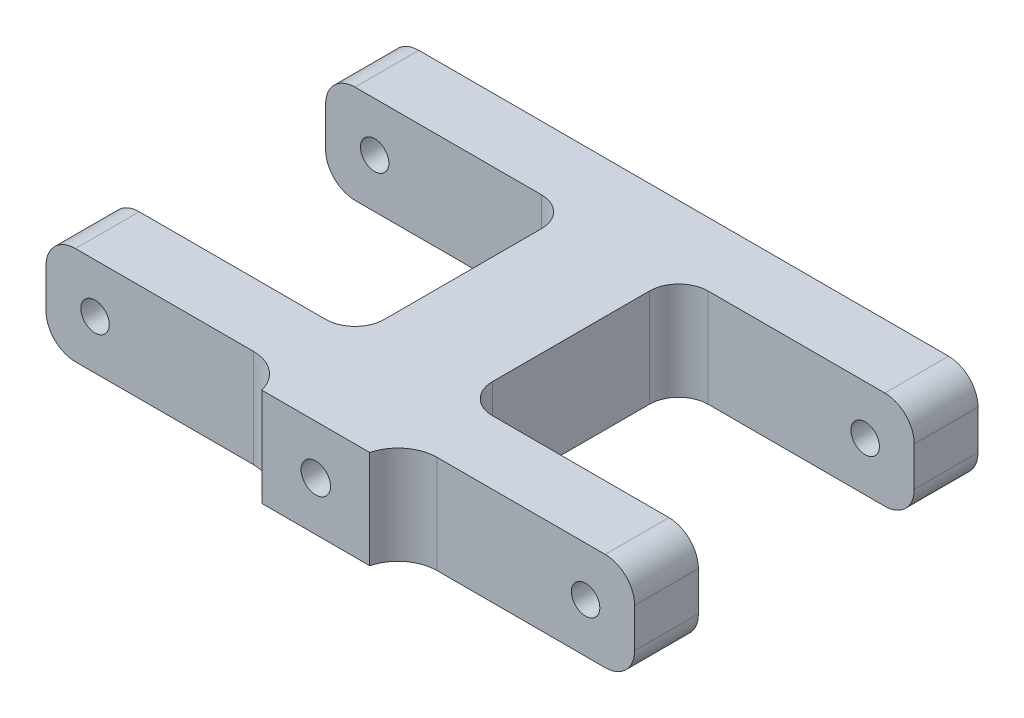
ISO-10303-21;
HEADER;
FILE_DESCRIPTION(('STEP AP214'),'2;1');
FILE_NAME('part.step','',(''),(''),'','','');
FILE_SCHEMA(('AUTOMOTIVE_DESIGN { 1 0 10303 214 1 1 1 1 }'));
ENDSEC;
DATA;
#1=APPLICATION_CONTEXT('core data for automotive mechanical design processes');
#2=APPLICATION_PROTOCOL_DEFINITION('international standard','automotive_design',2000,#1);
#3=PRODUCT_CONTEXT('',#1,'mechanical');
#4=PRODUCT('Part','Part','',(#3));
#5=PRODUCT_RELATED_PRODUCT_CATEGORY('part','',(#4));
#6=PRODUCT_DEFINITION_FORMATION('','',#4);
#7=PRODUCT_DEFINITION_CONTEXT('part definition',#1,'design');
#8=PRODUCT_DEFINITION('design','',#6,#7);
#9=PRODUCT_DEFINITION_SHAPE('','',#8);
#10=(LENGTH_UNIT() NAMED_UNIT(*) SI_UNIT(.MILLI.,.METRE.));
#11=(NAMED_UNIT(*) PLANE_ANGLE_UNIT() SI_UNIT($,.RADIAN.));
#12=(NAMED_UNIT(*) SI_UNIT($,.STERADIAN.) SOLID_ANGLE_UNIT());
#13=UNCERTAINTY_MEASURE_WITH_UNIT(LENGTH_MEASURE(1.E-05),#10,'distance_accuracy_value','');
#14=(GEOMETRIC_REPRESENTATION_CONTEXT(3) GLOBAL_UNCERTAINTY_ASSIGNED_CONTEXT((#13)) GLOBAL_UNIT_ASSIGNED_CONTEXT((#10,
#11,#12)) REPRESENTATION_CONTEXT('',''));
#15=CARTESIAN_POINT('',(0.,0.,0.));
#16=DIRECTION('',(0.,0.,1.));
#17=DIRECTION('',(1.,0.,0.));
#18=AXIS2_PLACEMENT_3D('',#15,#16,#17);
#19=CARTESIAN_POINT('',(0.,10.,35.));
#20=DIRECTION('',(0.,0.,-1.));
#21=DIRECTION('',(-1.,0.,0.));
#22=AXIS2_PLACEMENT_3D('',#19,#20,#21);
#23=PLANE('',#22);
#24=CARTESIAN_POINT('',(5.,5.,35.));
#25=DIRECTION('',(0.,0.,1.));
#26=DIRECTION('',(1.,0.,0.));
#27=AXIS2_PLACEMENT_3D('',#24,#25,#26);
#28=CIRCLE('',#27,1.45);
#29=CARTESIAN_POINT('',(6.45,5.,35.));
#30=VERTEX_POINT('',#29);
#31=EDGE_CURVE('E254',#30,#30,#28,.T.);
#32=ORIENTED_EDGE('',*,*,#31,.F.);
#33=EDGE_LOOP('',(#32));
#34=FACE_BOUND('',#33,.T.);
#35=DIRECTION('',(1.,0.,0.));
#36=VECTOR('',#35,1.);
#37=CARTESIAN_POINT('',(0.,0.,35.));
#38=LINE('',#37,#36);
#39=CARTESIAN_POINT('',(3.,0.,35.));
#40=VERTEX_POINT('',#39);
#41=CARTESIAN_POINT('',(21.1270166537926,0.,35.));
#42=VERTEX_POINT('',#41);
#43=EDGE_CURVE('E312',#40,#42,#38,.T.);
#44=ORIENTED_EDGE('',*,*,#43,.T.);
#45=DIRECTION('',(0.,-1.,0.));
#46=VECTOR('',#45,1.);
#47=CARTESIAN_POINT('',(21.1270166537926,10.,35.));
#48=LINE('',#47,#46);
#49=CARTESIAN_POINT('',(21.1270166537926,10.,35.));
#50=VERTEX_POINT('',#49);
#51=EDGE_CURVE('E54',#42,#50,#48,.F.);
#52=ORIENTED_EDGE('',*,*,#51,.T.);
#53=DIRECTION('',(1.,0.,0.));
#54=VECTOR('',#53,1.);
#55=CARTESIAN_POINT('',(0.,10.,35.));
#56=LINE('',#55,#54);
#57=CARTESIAN_POINT('',(3.,10.,35.));
#58=VERTEX_POINT('',#57);
#59=EDGE_CURVE('E305',#58,#50,#56,.T.);
#60=ORIENTED_EDGE('',*,*,#59,.F.);
#61=CARTESIAN_POINT('',(3.,7.,35.));
#62=DIRECTION('',(0.,0.,-1.));
#63=DIRECTION('',(-1.,0.,0.));
#64=AXIS2_PLACEMENT_3D('',#61,#62,#63);
#65=CIRCLE('',#64,3.);
#66=CARTESIAN_POINT('',(0.,7.,35.));
#67=VERTEX_POINT('',#66);
#68=EDGE_CURVE('E342',#58,#67,#65,.F.);
#69=ORIENTED_EDGE('',*,*,#68,.T.);
#70=DIRECTION('',(0.,-1.,0.));
#71=VECTOR('',#70,1.);
#72=CARTESIAN_POINT('',(0.,10.,35.));
#73=LINE('',#72,#71);
#74=CARTESIAN_POINT('',(0.,3.,35.));
#75=VERTEX_POINT('',#74);
#76=EDGE_CURVE('E325',#67,#75,#73,.T.);
#77=ORIENTED_EDGE('',*,*,#76,.T.);
#78=CARTESIAN_POINT('',(3.,3.,35.));
#79=DIRECTION('',(0.,0.,-1.));
#80=DIRECTION('',(-1.,0.,0.));
#81=AXIS2_PLACEMENT_3D('',#78,#79,#80);
#82=CIRCLE('',#81,3.);
#83=EDGE_CURVE('E344',#75,#40,#82,.F.);
#84=ORIENTED_EDGE('',*,*,#83,.T.);
#85=EDGE_LOOP('',(#44,#52,#60,#69,#77,#84));
#86=FACE_BOUND('',#85,.T.);
#87=ADVANCED_FACE('F33',(#34,#86),#23,.F.);
#88=CARTESIAN_POINT('',(55.,5.,35.));
#89=DIRECTION('',(0.,0.,1.));
#90=DIRECTION('',(1.,0.,0.));
#91=AXIS2_PLACEMENT_3D('',#88,#89,#90);
#92=CIRCLE('',#91,1.45);
#93=CARTESIAN_POINT('',(56.45,5.,35.));
#94=VERTEX_POINT('',#93);
#95=EDGE_CURVE('E244',#94,#94,#92,.T.);
#96=ORIENTED_EDGE('',*,*,#95,.F.);
#97=EDGE_LOOP('',(#96));
#98=FACE_BOUND('',#97,.T.);
#99=CARTESIAN_POINT('',(39.8729833462074,10.,35.));
#100=VERTEX_POINT('',#99);
#101=CARTESIAN_POINT('',(57.,10.,35.));
#102=VERTEX_POINT('',#101);
#103=EDGE_CURVE('E308',#100,#102,#56,.T.);
#104=ORIENTED_EDGE('',*,*,#103,.F.);
#105=DIRECTION('',(0.,1.,0.));
#106=VECTOR('',#105,1.);
#107=CARTESIAN_POINT('',(39.8729833462074,10.,35.));
#108=LINE('',#107,#106);
#109=CARTESIAN_POINT('',(39.8729833462074,0.,35.));
#110=VERTEX_POINT('',#109);
#111=EDGE_CURVE('E448',#100,#110,#108,.F.);
#112=ORIENTED_EDGE('',*,*,#111,.T.);
#113=CARTESIAN_POINT('',(57.,0.,35.));
#114=VERTEX_POINT('',#113);
#115=EDGE_CURVE('E299',#110,#114,#38,.T.);
#116=ORIENTED_EDGE('',*,*,#115,.T.);
#117=CARTESIAN_POINT('',(57.,3.,35.));
#118=DIRECTION('',(0.,0.,-1.));
#119=DIRECTION('',(-1.,0.,0.));
#120=AXIS2_PLACEMENT_3D('',#117,#118,#119);
#121=CIRCLE('',#120,3.);
#122=CARTESIAN_POINT('',(60.,3.,35.));
#123=VERTEX_POINT('',#122);
#124=EDGE_CURVE('E340',#114,#123,#121,.F.);
#125=ORIENTED_EDGE('',*,*,#124,.T.);
#126=DIRECTION('',(0.,-1.,0.));
#127=VECTOR('',#126,1.);
#128=CARTESIAN_POINT('',(60.,10.,35.));
#129=LINE('',#128,#127);
#130=CARTESIAN_POINT('',(60.,7.,35.));
#131=VERTEX_POINT('',#130);
#132=EDGE_CURVE('E322',#131,#123,#129,.T.);
#133=ORIENTED_EDGE('',*,*,#132,.F.);
#134=CARTESIAN_POINT('',(57.,7.,35.));
#135=DIRECTION('',(0.,0.,-1.));
#136=DIRECTION('',(-1.,0.,0.));
#137=AXIS2_PLACEMENT_3D('',#134,#135,#136);
#138=CIRCLE('',#137,3.);
#139=EDGE_CURVE('E337',#131,#102,#138,.F.);
#140=ORIENTED_EDGE('',*,*,#139,.T.);
#141=EDGE_LOOP('',(#104,#112,#116,#125,#133,#140));
#142=FACE_BOUND('',#141,.T.);
#143=ADVANCED_FACE('F460',(#98,#142),#23,.F.);
#144=CARTESIAN_POINT('',(0.,10.,0.));
#145=DIRECTION('',(1.,0.,0.));
#146=DIRECTION('',(0.,0.,-1.));
#147=AXIS2_PLACEMENT_3D('',#144,#145,#146);
#148=PLANE('',#147);
#149=DIRECTION('',(0.,-1.,0.));
#150=VECTOR('',#149,1.);
#151=CARTESIAN_POINT('',(0.,10.,0.));
#152=LINE('',#151,#150);
#153=CARTESIAN_POINT('',(0.,7.,0.));
#154=VERTEX_POINT('',#153);
#155=CARTESIAN_POINT('',(0.,3.,0.));
#156=VERTEX_POINT('',#155);
#157=EDGE_CURVE('E311',#154,#156,#152,.T.);
#158=ORIENTED_EDGE('',*,*,#157,.T.);
#159=DIRECTION('',(0.,0.,1.));
#160=VECTOR('',#159,1.);
#161=CARTESIAN_POINT('',(0.,3.,0.));
#162=LINE('',#161,#160);
#163=CARTESIAN_POINT('',(0.,3.,6.5));
#164=VERTEX_POINT('',#163);
#165=EDGE_CURVE('E376',#156,#164,#162,.T.);
#166=ORIENTED_EDGE('',*,*,#165,.T.);
#167=DIRECTION('',(0.,-1.,0.));
#168=VECTOR('',#167,1.);
#169=CARTESIAN_POINT('',(0.,10.,6.5));
#170=LINE('',#169,#168);
#171=CARTESIAN_POINT('',(0.,7.,6.5));
#172=VERTEX_POINT('',#171);
#173=EDGE_CURVE('E264',#172,#164,#170,.T.);
#174=ORIENTED_EDGE('',*,*,#173,.F.);
#175=DIRECTION('',(0.,0.,1.));
#176=VECTOR('',#175,1.);
#177=CARTESIAN_POINT('',(0.,7.,0.));
#178=LINE('',#177,#176);
#179=EDGE_CURVE('E374',#172,#154,#178,.F.);
#180=ORIENTED_EDGE('',*,*,#179,.T.);
#181=EDGE_LOOP('',(#158,#166,#174,#180));
#182=FACE_BOUND('',#181,.T.);
#183=ADVANCED_FACE('F481',(#182),#148,.F.);
#184=CARTESIAN_POINT('',(60.,10.,0.));
#185=DIRECTION('',(-1.,0.,0.));
#186=DIRECTION('',(0.,0.,1.));
#187=AXIS2_PLACEMENT_3D('',#184,#185,#186);
#188=PLANE('',#187);
#189=ORIENTED_EDGE('',*,*,#132,.T.);
#190=DIRECTION('',(0.,0.,-1.));
#191=VECTOR('',#190,1.);
#192=CARTESIAN_POINT('',(60.,3.,0.));
#193=LINE('',#192,#191);
#194=CARTESIAN_POINT('',(60.,3.,28.5));
#195=VERTEX_POINT('',#194);
#196=EDGE_CURVE('E404',#123,#195,#193,.T.);
#197=ORIENTED_EDGE('',*,*,#196,.T.);
#198=DIRECTION('',(0.,-1.,0.));
#199=VECTOR('',#198,1.);
#200=CARTESIAN_POINT('',(60.,10.,28.5));
#201=LINE('',#200,#199);
#202=CARTESIAN_POINT('',(60.,7.,28.5));
#203=VERTEX_POINT('',#202);
#204=EDGE_CURVE('E279',#203,#195,#201,.T.);
#205=ORIENTED_EDGE('',*,*,#204,.F.);
#206=DIRECTION('',(0.,0.,-1.));
#207=VECTOR('',#206,1.);
#208=CARTESIAN_POINT('',(60.,7.,35.));
#209=LINE('',#208,#207);
#210=EDGE_CURVE('E402',#203,#131,#209,.F.);
#211=ORIENTED_EDGE('',*,*,#210,.T.);
#212=EDGE_LOOP('',(#189,#197,#205,#211));
#213=FACE_BOUND('',#212,.T.);
#214=ADVANCED_FACE('F491',(#213),#188,.F.);
#215=DIRECTION('',(0.,1.,0.));
#216=VECTOR('',#215,1.);
#217=CARTESIAN_POINT('',(0.,10.,28.5));
#218=LINE('',#217,#216);
#219=CARTESIAN_POINT('',(0.,3.,28.5));
#220=VERTEX_POINT('',#219);
#221=CARTESIAN_POINT('',(0.,7.,28.5));
#222=VERTEX_POINT('',#221);
#223=EDGE_CURVE('E269',#220,#222,#218,.T.);
#224=ORIENTED_EDGE('',*,*,#223,.F.);
#225=DIRECTION('',(0.,0.,1.));
#226=VECTOR('',#225,1.);
#227=CARTESIAN_POINT('',(0.,3.,0.));
#228=LINE('',#227,#226);
#229=EDGE_CURVE('E334',#220,#75,#228,.T.);
#230=ORIENTED_EDGE('',*,*,#229,.T.);
#231=ORIENTED_EDGE('',*,*,#76,.F.);
#232=DIRECTION('',(0.,0.,1.));
#233=VECTOR('',#232,1.);
#234=CARTESIAN_POINT('',(0.,7.,28.5));
#235=LINE('',#234,#233);
#236=EDGE_CURVE('E328',#67,#222,#235,.F.);
#237=ORIENTED_EDGE('',*,*,#236,.T.);
#238=EDGE_LOOP('',(#224,#230,#231,#237));
#239=FACE_BOUND('',#238,.T.);
#240=ADVANCED_FACE('F488',(#239),#148,.F.);
#241=DIRECTION('',(0.,-1.,0.));
#242=VECTOR('',#241,1.);
#243=CARTESIAN_POINT('',(60.,10.,0.));
#244=LINE('',#243,#242);
#245=CARTESIAN_POINT('',(60.,7.,0.));
#246=VERTEX_POINT('',#245);
#247=CARTESIAN_POINT('',(60.,3.,0.));
#248=VERTEX_POINT('',#247);
#249=EDGE_CURVE('E319',#246,#248,#244,.T.);
#250=ORIENTED_EDGE('',*,*,#249,.F.);
#251=DIRECTION('',(0.,0.,-1.));
#252=VECTOR('',#251,1.);
#253=CARTESIAN_POINT('',(60.,7.,6.5));
#254=LINE('',#253,#252);
#255=CARTESIAN_POINT('',(60.,7.,6.5));
#256=VERTEX_POINT('',#255);
#257=EDGE_CURVE('E395',#246,#256,#254,.F.);
#258=ORIENTED_EDGE('',*,*,#257,.T.);
#259=DIRECTION('',(0.,1.,0.));
#260=VECTOR('',#259,1.);
#261=CARTESIAN_POINT('',(60.,10.,6.5));
#262=LINE('',#261,#260);
#263=CARTESIAN_POINT('',(60.,3.,6.5));
#264=VERTEX_POINT('',#263);
#265=EDGE_CURVE('E289',#264,#256,#262,.T.);
#266=ORIENTED_EDGE('',*,*,#265,.F.);
#267=DIRECTION('',(0.,0.,-1.));
#268=VECTOR('',#267,1.);
#269=CARTESIAN_POINT('',(60.,3.,0.));
#270=LINE('',#269,#268);
#271=EDGE_CURVE('E392',#264,#248,#270,.T.);
#272=ORIENTED_EDGE('',*,*,#271,.T.);
#273=EDGE_LOOP('',(#250,#258,#266,#272));
#274=FACE_BOUND('',#273,.T.);
#275=ADVANCED_FACE('F486',(#274),#188,.F.);
#276=CARTESIAN_POINT('',(0.,10.,0.));
#277=DIRECTION('',(0.,0.,1.));
#278=DIRECTION('',(1.,0.,0.));
#279=AXIS2_PLACEMENT_3D('',#276,#277,#278);
#280=PLANE('',#279);
#281=CARTESIAN_POINT('',(55.,5.,0.));
#282=DIRECTION('',(0.,0.,1.));
#283=DIRECTION('',(1.,0.,0.));
#284=AXIS2_PLACEMENT_3D('',#281,#282,#283);
#285=CIRCLE('',#284,1.45);
#286=CARTESIAN_POINT('',(56.45,5.,0.));
#287=VERTEX_POINT('',#286);
#288=EDGE_CURVE('E245',#287,#287,#285,.T.);
#289=ORIENTED_EDGE('',*,*,#288,.T.);
#290=EDGE_LOOP('',(#289));
#291=FACE_BOUND('',#290,.T.);
#292=CARTESIAN_POINT('',(5.,5.,0.));
#293=DIRECTION('',(0.,0.,1.));
#294=DIRECTION('',(1.,0.,0.));
#295=AXIS2_PLACEMENT_3D('',#292,#293,#294);
#296=CIRCLE('',#295,1.45);
#297=CARTESIAN_POINT('',(6.45,5.,0.));
#298=VERTEX_POINT('',#297);
#299=EDGE_CURVE('E255',#298,#298,#296,.T.);
#300=ORIENTED_EDGE('',*,*,#299,.T.);
#301=EDGE_LOOP('',(#300));
#302=FACE_BOUND('',#301,.T.);
#303=DIRECTION('',(-1.,0.,0.));
#304=VECTOR('',#303,1.);
#305=CARTESIAN_POINT('',(0.,0.,0.));
#306=LINE('',#305,#304);
#307=CARTESIAN_POINT('',(57.,0.,0.));
#308=VERTEX_POINT('',#307);
#309=CARTESIAN_POINT('',(3.,0.,0.));
#310=VERTEX_POINT('',#309);
#311=EDGE_CURVE('E314',#308,#310,#306,.T.);
#312=ORIENTED_EDGE('',*,*,#311,.T.);
#313=CARTESIAN_POINT('',(3.,3.,0.));
#314=DIRECTION('',(0.,0.,1.));
#315=DIRECTION('',(1.,0.,0.));
#316=AXIS2_PLACEMENT_3D('',#313,#314,#315);
#317=CIRCLE('',#316,3.);
#318=EDGE_CURVE('E390',#310,#156,#317,.F.);
#319=ORIENTED_EDGE('',*,*,#318,.T.);
#320=ORIENTED_EDGE('',*,*,#157,.F.);
#321=CARTESIAN_POINT('',(3.,7.,0.));
#322=DIRECTION('',(0.,0.,1.));
#323=DIRECTION('',(1.,0.,0.));
#324=AXIS2_PLACEMENT_3D('',#321,#322,#323);
#325=CIRCLE('',#324,3.);
#326=CARTESIAN_POINT('',(3.,10.,0.));
#327=VERTEX_POINT('',#326);
#328=EDGE_CURVE('E388',#154,#327,#325,.F.);
#329=ORIENTED_EDGE('',*,*,#328,.T.);
#330=DIRECTION('',(-1.,0.,0.));
#331=VECTOR('',#330,1.);
#332=CARTESIAN_POINT('',(0.,10.,0.));
#333=LINE('',#332,#331);
#334=CARTESIAN_POINT('',(57.,10.,0.));
#335=VERTEX_POINT('',#334);
#336=EDGE_CURVE('E307',#335,#327,#333,.T.);
#337=ORIENTED_EDGE('',*,*,#336,.F.);
#338=CARTESIAN_POINT('',(57.,7.,0.));
#339=DIRECTION('',(0.,0.,1.));
#340=DIRECTION('',(1.,0.,0.));
#341=AXIS2_PLACEMENT_3D('',#338,#339,#340);
#342=CIRCLE('',#341,3.);
#343=EDGE_CURVE('E386',#335,#246,#342,.F.);
#344=ORIENTED_EDGE('',*,*,#343,.T.);
#345=ORIENTED_EDGE('',*,*,#249,.T.);
#346=CARTESIAN_POINT('',(57.,3.,0.));
#347=DIRECTION('',(0.,0.,1.));
#348=DIRECTION('',(1.,0.,0.));
#349=AXIS2_PLACEMENT_3D('',#346,#347,#348);
#350=CIRCLE('',#349,3.);
#351=EDGE_CURVE('E384',#248,#308,#350,.F.);
#352=ORIENTED_EDGE('',*,*,#351,.T.);
#353=EDGE_LOOP('',(#312,#319,#320,#329,#337,#344,#345,#352));
#354=FACE_BOUND('',#353,.T.);
#355=ADVANCED_FACE('F577',(#291,#302,#354),#280,.F.);
#356=CARTESIAN_POINT('',(0.,10.,0.));
#357=DIRECTION('',(0.,1.,0.));
#358=DIRECTION('',(0.,0.,1.));
#359=AXIS2_PLACEMENT_3D('',#356,#357,#358);
#360=PLANE('',#359);
#361=DIRECTION('',(0.,0.,-1.));
#362=VECTOR('',#361,1.);
#363=CARTESIAN_POINT('',(25.,10.,6.5));
#364=LINE('',#363,#362);
#365=CARTESIAN_POINT('',(25.,10.,25.5));
#366=VERTEX_POINT('',#365);
#367=CARTESIAN_POINT('',(25.,10.,9.5));
#368=VERTEX_POINT('',#367);
#369=EDGE_CURVE('E268',#366,#368,#364,.T.);
#370=ORIENTED_EDGE('',*,*,#369,.F.);
#371=CARTESIAN_POINT('',(22.,10.,25.5));
#372=DIRECTION('',(0.,1.,0.));
#373=DIRECTION('',(0.,0.,1.));
#374=AXIS2_PLACEMENT_3D('',#371,#372,#373);
#375=CIRCLE('',#374,3.);
#376=CARTESIAN_POINT('',(22.,10.,28.5));
#377=VERTEX_POINT('',#376);
#378=EDGE_CURVE('E440',#366,#377,#375,.F.);
#379=ORIENTED_EDGE('',*,*,#378,.T.);
#380=DIRECTION('',(-1.,0.,0.));
#381=VECTOR('',#380,1.);
#382=CARTESIAN_POINT('',(25.,10.,28.5));
#383=LINE('',#382,#381);
#384=CARTESIAN_POINT('',(3.,10.,28.5));
#385=VERTEX_POINT('',#384);
#386=EDGE_CURVE('E280',#377,#385,#383,.T.);
#387=ORIENTED_EDGE('',*,*,#386,.T.);
#388=DIRECTION('',(0.,0.,1.));
#389=VECTOR('',#388,1.);
#390=CARTESIAN_POINT('',(3.,10.,35.));
#391=LINE('',#390,#389);
#392=EDGE_CURVE('E371',#385,#58,#391,.T.);
#393=ORIENTED_EDGE('',*,*,#392,.T.);
#394=ORIENTED_EDGE('',*,*,#59,.T.);
#395=CARTESIAN_POINT('',(21.1270166537926,10.,39.));
#396=DIRECTION('',(0.,1.,0.));
#397=DIRECTION('',(0.,0.,1.));
#398=AXIS2_PLACEMENT_3D('',#395,#396,#397);
#399=CIRCLE('',#398,4.);
#400=CARTESIAN_POINT('',(25.,10.,38.));
#401=VERTEX_POINT('',#400);
#402=EDGE_CURVE('E11',#50,#401,#399,.F.);
#403=ORIENTED_EDGE('',*,*,#402,.T.);
#404=DIRECTION('',(-1.,0.,0.));
#405=VECTOR('',#404,1.);
#406=CARTESIAN_POINT('',(25.,10.,38.));
#407=LINE('',#406,#405);
#408=CARTESIAN_POINT('',(36.,10.,38.));
#409=VERTEX_POINT('',#408);
#410=EDGE_CURVE('E234',#409,#401,#407,.T.);
#411=ORIENTED_EDGE('',*,*,#410,.F.);
#412=CARTESIAN_POINT('',(39.8729833462074,10.,39.));
#413=DIRECTION('',(0.,1.,0.));
#414=DIRECTION('',(0.,0.,1.));
#415=AXIS2_PLACEMENT_3D('',#412,#413,#414);
#416=CIRCLE('',#415,4.);
#417=EDGE_CURVE('E451',#409,#100,#416,.F.);
#418=ORIENTED_EDGE('',*,*,#417,.T.);
#419=ORIENTED_EDGE('',*,*,#103,.T.);
#420=DIRECTION('',(0.,0.,-1.));
#421=VECTOR('',#420,1.);
#422=CARTESIAN_POINT('',(57.,10.,28.5));
#423=LINE('',#422,#421);
#424=CARTESIAN_POINT('',(57.,10.,28.5));
#425=VERTEX_POINT('',#424);
#426=EDGE_CURVE('E362',#102,#425,#423,.T.);
#427=ORIENTED_EDGE('',*,*,#426,.T.);
#428=DIRECTION('',(1.,0.,0.));
#429=VECTOR('',#428,1.);
#430=CARTESIAN_POINT('',(36.,10.,28.5));
#431=LINE('',#430,#429);
#432=CARTESIAN_POINT('',(39.,10.,28.5));
#433=VERTEX_POINT('',#432);
#434=EDGE_CURVE('E297',#433,#425,#431,.T.);
#435=ORIENTED_EDGE('',*,*,#434,.F.);
#436=CARTESIAN_POINT('',(39.,10.,25.5));
#437=DIRECTION('',(0.,1.,0.));
#438=DIRECTION('',(0.,0.,1.));
#439=AXIS2_PLACEMENT_3D('',#436,#437,#438);
#440=CIRCLE('',#439,3.);
#441=CARTESIAN_POINT('',(36.,10.,25.5));
#442=VERTEX_POINT('',#441);
#443=EDGE_CURVE('E434',#433,#442,#440,.F.);
#444=ORIENTED_EDGE('',*,*,#443,.T.);
#445=DIRECTION('',(0.,0.,1.));
#446=VECTOR('',#445,1.);
#447=CARTESIAN_POINT('',(36.,10.,28.5));
#448=LINE('',#447,#446);
#449=CARTESIAN_POINT('',(36.,10.,9.5));
#450=VERTEX_POINT('',#449);
#451=EDGE_CURVE('E288',#450,#442,#448,.T.);
#452=ORIENTED_EDGE('',*,*,#451,.F.);
#453=CARTESIAN_POINT('',(39.,10.,9.5));
#454=DIRECTION('',(0.,1.,0.));
#455=DIRECTION('',(0.,0.,1.));
#456=AXIS2_PLACEMENT_3D('',#453,#454,#455);
#457=CIRCLE('',#456,3.);
#458=CARTESIAN_POINT('',(39.,10.,6.5));
#459=VERTEX_POINT('',#458);
#460=EDGE_CURVE('E436',#450,#459,#457,.F.);
#461=ORIENTED_EDGE('',*,*,#460,.T.);
#462=DIRECTION('',(1.,0.,0.));
#463=VECTOR('',#462,1.);
#464=CARTESIAN_POINT('',(36.,10.,6.5));
#465=LINE('',#464,#463);
#466=CARTESIAN_POINT('',(57.,10.,6.5));
#467=VERTEX_POINT('',#466);
#468=EDGE_CURVE('E300',#459,#467,#465,.T.);
#469=ORIENTED_EDGE('',*,*,#468,.T.);
#470=DIRECTION('',(0.,0.,-1.));
#471=VECTOR('',#470,1.);
#472=CARTESIAN_POINT('',(57.,10.,0.));
#473=LINE('',#472,#471);
#474=EDGE_CURVE('E365',#467,#335,#473,.T.);
#475=ORIENTED_EDGE('',*,*,#474,.T.);
#476=ORIENTED_EDGE('',*,*,#336,.T.);
#477=DIRECTION('',(0.,0.,1.));
#478=VECTOR('',#477,1.);
#479=CARTESIAN_POINT('',(3.,10.,6.5));
#480=LINE('',#479,#478);
#481=CARTESIAN_POINT('',(3.,10.,6.5));
#482=VERTEX_POINT('',#481);
#483=EDGE_CURVE('E368',#327,#482,#480,.T.);
#484=ORIENTED_EDGE('',*,*,#483,.T.);
#485=DIRECTION('',(-1.,0.,0.));
#486=VECTOR('',#485,1.);
#487=CARTESIAN_POINT('',(25.,10.,6.5));
#488=LINE('',#487,#486);
#489=CARTESIAN_POINT('',(22.,10.,6.5));
#490=VERTEX_POINT('',#489);
#491=EDGE_CURVE('E277',#490,#482,#488,.T.);
#492=ORIENTED_EDGE('',*,*,#491,.F.);
#493=CARTESIAN_POINT('',(22.,10.,9.5));
#494=DIRECTION('',(0.,1.,0.));
#495=DIRECTION('',(0.,0.,1.));
#496=AXIS2_PLACEMENT_3D('',#493,#494,#495);
#497=CIRCLE('',#496,3.);
#498=EDGE_CURVE('E446',#490,#368,#497,.F.);
#499=ORIENTED_EDGE('',*,*,#498,.T.);
#500=EDGE_LOOP('',(#370,#379,#387,#393,#394,#403,#411,#418,#419,#427,#435,#444,#452,#461,#469,
#475,#476,#484,#492,#499));
#501=FACE_BOUND('',#500,.T.);
#502=ADVANCED_FACE('F456',(#501),#360,.T.);
#503=CARTESIAN_POINT('',(0.,0.,0.));
#504=DIRECTION('',(0.,1.,0.));
#505=DIRECTION('',(0.,0.,1.));
#506=AXIS2_PLACEMENT_3D('',#503,#504,#505);
#507=PLANE('',#506);
#508=ORIENTED_EDGE('',*,*,#43,.F.);
#509=DIRECTION('',(0.,0.,1.));
#510=VECTOR('',#509,1.);
#511=CARTESIAN_POINT('',(3.,0.,0.));
#512=LINE('',#511,#510);
#513=CARTESIAN_POINT('',(3.,0.,28.5));
#514=VERTEX_POINT('',#513);
#515=EDGE_CURVE('E354',#40,#514,#512,.F.);
#516=ORIENTED_EDGE('',*,*,#515,.T.);
#517=DIRECTION('',(-1.,0.,0.));
#518=VECTOR('',#517,1.);
#519=CARTESIAN_POINT('',(25.,0.,28.5));
#520=LINE('',#519,#518);
#521=CARTESIAN_POINT('',(22.,0.,28.5));
#522=VERTEX_POINT('',#521);
#523=EDGE_CURVE('E282',#522,#514,#520,.T.);
#524=ORIENTED_EDGE('',*,*,#523,.F.);
#525=CARTESIAN_POINT('',(22.,0.,25.5));
#526=DIRECTION('',(0.,1.,0.));
#527=DIRECTION('',(0.,0.,1.));
#528=AXIS2_PLACEMENT_3D('',#525,#526,#527);
#529=CIRCLE('',#528,3.);
#530=CARTESIAN_POINT('',(25.,0.,25.5));
#531=VERTEX_POINT('',#530);
#532=EDGE_CURVE('E442',#522,#531,#529,.T.);
#533=ORIENTED_EDGE('',*,*,#532,.T.);
#534=DIRECTION('',(0.,0.,1.));
#535=VECTOR('',#534,1.);
#536=CARTESIAN_POINT('',(25.,0.,6.5));
#537=LINE('',#536,#535);
#538=CARTESIAN_POINT('',(25.,0.,9.5));
#539=VERTEX_POINT('',#538);
#540=EDGE_CURVE('E265',#539,#531,#537,.T.);
#541=ORIENTED_EDGE('',*,*,#540,.F.);
#542=CARTESIAN_POINT('',(22.,0.,9.5));
#543=DIRECTION('',(0.,1.,0.));
#544=DIRECTION('',(0.,0.,1.));
#545=AXIS2_PLACEMENT_3D('',#542,#543,#544);
#546=CIRCLE('',#545,3.);
#547=CARTESIAN_POINT('',(22.,0.,6.5));
#548=VERTEX_POINT('',#547);
#549=EDGE_CURVE('E444',#539,#548,#546,.T.);
#550=ORIENTED_EDGE('',*,*,#549,.T.);
#551=DIRECTION('',(-1.,0.,0.));
#552=VECTOR('',#551,1.);
#553=CARTESIAN_POINT('',(25.,0.,6.5));
#554=LINE('',#553,#552);
#555=CARTESIAN_POINT('',(3.,0.,6.5));
#556=VERTEX_POINT('',#555);
#557=EDGE_CURVE('E272',#548,#556,#554,.T.);
#558=ORIENTED_EDGE('',*,*,#557,.T.);
#559=DIRECTION('',(0.,0.,1.));
#560=VECTOR('',#559,1.);
#561=CARTESIAN_POINT('',(3.,0.,0.));
#562=LINE('',#561,#560);
#563=EDGE_CURVE('E352',#556,#310,#562,.F.);
#564=ORIENTED_EDGE('',*,*,#563,.T.);
#565=ORIENTED_EDGE('',*,*,#311,.F.);
#566=DIRECTION('',(0.,0.,-1.));
#567=VECTOR('',#566,1.);
#568=CARTESIAN_POINT('',(57.,0.,0.));
#569=LINE('',#568,#567);
#570=CARTESIAN_POINT('',(57.,0.,6.5));
#571=VERTEX_POINT('',#570);
#572=EDGE_CURVE('E349',#308,#571,#569,.F.);
#573=ORIENTED_EDGE('',*,*,#572,.T.);
#574=DIRECTION('',(1.,0.,0.));
#575=VECTOR('',#574,1.);
#576=CARTESIAN_POINT('',(36.,0.,6.5));
#577=LINE('',#576,#575);
#578=CARTESIAN_POINT('',(39.,0.,6.5));
#579=VERTEX_POINT('',#578);
#580=EDGE_CURVE('E302',#579,#571,#577,.T.);
#581=ORIENTED_EDGE('',*,*,#580,.F.);
#582=CARTESIAN_POINT('',(39.,0.,9.5));
#583=DIRECTION('',(0.,1.,0.));
#584=DIRECTION('',(0.,0.,1.));
#585=AXIS2_PLACEMENT_3D('',#582,#583,#584);
#586=CIRCLE('',#585,3.);
#587=CARTESIAN_POINT('',(36.,0.,9.5));
#588=VERTEX_POINT('',#587);
#589=EDGE_CURVE('E438',#579,#588,#586,.T.);
#590=ORIENTED_EDGE('',*,*,#589,.T.);
#591=DIRECTION('',(0.,0.,-1.));
#592=VECTOR('',#591,1.);
#593=CARTESIAN_POINT('',(36.,0.,28.5));
#594=LINE('',#593,#592);
#595=CARTESIAN_POINT('',(36.,0.,25.5));
#596=VERTEX_POINT('',#595);
#597=EDGE_CURVE('E285',#596,#588,#594,.T.);
#598=ORIENTED_EDGE('',*,*,#597,.F.);
#599=CARTESIAN_POINT('',(39.,0.,25.5));
#600=DIRECTION('',(0.,1.,0.));
#601=DIRECTION('',(0.,0.,1.));
#602=AXIS2_PLACEMENT_3D('',#599,#600,#601);
#603=CIRCLE('',#602,3.);
#604=CARTESIAN_POINT('',(39.,0.,28.5));
#605=VERTEX_POINT('',#604);
#606=EDGE_CURVE('E432',#596,#605,#603,.T.);
#607=ORIENTED_EDGE('',*,*,#606,.T.);
#608=DIRECTION('',(1.,0.,0.));
#609=VECTOR('',#608,1.);
#610=CARTESIAN_POINT('',(36.,0.,28.5));
#611=LINE('',#610,#609);
#612=CARTESIAN_POINT('',(57.,0.,28.5));
#613=VERTEX_POINT('',#612);
#614=EDGE_CURVE('E292',#605,#613,#611,.T.);
#615=ORIENTED_EDGE('',*,*,#614,.T.);
#616=DIRECTION('',(0.,0.,-1.));
#617=VECTOR('',#616,1.);
#618=CARTESIAN_POINT('',(57.,0.,0.));
#619=LINE('',#618,#617);
#620=EDGE_CURVE('E346',#613,#114,#619,.F.);
#621=ORIENTED_EDGE('',*,*,#620,.T.);
#622=ORIENTED_EDGE('',*,*,#115,.F.);
#623=CARTESIAN_POINT('',(39.8729833462074,0.,39.));
#624=DIRECTION('',(0.,1.,0.));
#625=DIRECTION('',(0.,0.,1.));
#626=AXIS2_PLACEMENT_3D('',#623,#624,#625);
#627=CIRCLE('',#626,4.);
#628=CARTESIAN_POINT('',(36.,0.,38.));
#629=VERTEX_POINT('',#628);
#630=EDGE_CURVE('E220',#110,#629,#627,.T.);
#631=ORIENTED_EDGE('',*,*,#630,.T.);
#632=DIRECTION('',(1.,0.,0.));
#633=VECTOR('',#632,1.);
#634=CARTESIAN_POINT('',(25.,0.,38.));
#635=LINE('',#634,#633);
#636=CARTESIAN_POINT('',(25.,0.,38.));
#637=VERTEX_POINT('',#636);
#638=EDGE_CURVE('E222',#637,#629,#635,.T.);
#639=ORIENTED_EDGE('',*,*,#638,.F.);
#640=CARTESIAN_POINT('',(21.1270166537926,0.,39.));
#641=DIRECTION('',(0.,1.,0.));
#642=DIRECTION('',(0.,0.,1.));
#643=AXIS2_PLACEMENT_3D('',#640,#641,#642);
#644=CIRCLE('',#643,4.);
#645=EDGE_CURVE('E41',#637,#42,#644,.T.);
#646=ORIENTED_EDGE('',*,*,#645,.T.);
#647=EDGE_LOOP('',(#508,#516,#524,#533,#541,#550,#558,#564,#565,#573,#581,#590,#598,#607,#615,
#621,#622,#631,#639,#646));
#648=FACE_BOUND('',#647,.T.);
#649=ADVANCED_FACE('F223',(#648),#507,.F.);
#650=CARTESIAN_POINT('',(36.,10.,28.5));
#651=DIRECTION('',(0.,0.,1.));
#652=DIRECTION('',(1.,0.,0.));
#653=AXIS2_PLACEMENT_3D('',#650,#651,#652);
#654=PLANE('',#653);
#655=CARTESIAN_POINT('',(55.,5.,28.5));
#656=DIRECTION('',(0.,0.,1.));
#657=DIRECTION('',(1.,0.,0.));
#658=AXIS2_PLACEMENT_3D('',#655,#656,#657);
#659=CIRCLE('',#658,1.45);
#660=CARTESIAN_POINT('',(56.45,5.,28.5));
#661=VERTEX_POINT('',#660);
#662=EDGE_CURVE('E251',#661,#661,#659,.T.);
#663=ORIENTED_EDGE('',*,*,#662,.T.);
#664=EDGE_LOOP('',(#663));
#665=FACE_BOUND('',#664,.T.);
#666=ORIENTED_EDGE('',*,*,#614,.F.);
#667=DIRECTION('',(0.,-1.,0.));
#668=VECTOR('',#667,1.);
#669=CARTESIAN_POINT('',(39.,10.,28.5));
#670=LINE('',#669,#668);
#671=EDGE_CURVE('E418',#605,#433,#670,.F.);
#672=ORIENTED_EDGE('',*,*,#671,.T.);
#673=ORIENTED_EDGE('',*,*,#434,.T.);
#674=CARTESIAN_POINT('',(57.,7.,28.5));
#675=DIRECTION('',(0.,0.,1.));
#676=DIRECTION('',(1.,0.,0.));
#677=AXIS2_PLACEMENT_3D('',#674,#675,#676);
#678=CIRCLE('',#677,3.);
#679=EDGE_CURVE('E407',#425,#203,#678,.F.);
#680=ORIENTED_EDGE('',*,*,#679,.T.);
#681=ORIENTED_EDGE('',*,*,#204,.T.);
#682=CARTESIAN_POINT('',(57.,3.,28.5));
#683=DIRECTION('',(0.,0.,1.));
#684=DIRECTION('',(1.,0.,0.));
#685=AXIS2_PLACEMENT_3D('',#682,#683,#684);
#686=CIRCLE('',#685,3.);
#687=EDGE_CURVE('E409',#195,#613,#686,.F.);
#688=ORIENTED_EDGE('',*,*,#687,.T.);
#689=EDGE_LOOP('',(#666,#672,#673,#680,#681,#688));
#690=FACE_BOUND('',#689,.T.);
#691=ADVANCED_FACE('F615',(#665,#690),#654,.F.);
#692=CARTESIAN_POINT('',(36.,10.,6.5));
#693=DIRECTION('',(0.,0.,-1.));
#694=DIRECTION('',(0.,1.,0.));
#695=AXIS2_PLACEMENT_3D('',#692,#693,#694);
#696=PLANE('',#695);
#697=CARTESIAN_POINT('',(55.,5.,6.5));
#698=DIRECTION('',(0.,0.,-1.));
#699=DIRECTION('',(0.,1.,0.));
#700=AXIS2_PLACEMENT_3D('',#697,#698,#699);
#701=CIRCLE('',#700,1.45);
#702=CARTESIAN_POINT('',(55.,6.45,6.5));
#703=VERTEX_POINT('',#702);
#704=EDGE_CURVE('E248',#703,#703,#701,.T.);
#705=ORIENTED_EDGE('',*,*,#704,.T.);
#706=EDGE_LOOP('',(#705));
#707=FACE_BOUND('',#706,.T.);
#708=ORIENTED_EDGE('',*,*,#468,.F.);
#709=DIRECTION('',(0.,1.,0.));
#710=VECTOR('',#709,1.);
#711=CARTESIAN_POINT('',(39.,10.,6.5));
#712=LINE('',#711,#710);
#713=EDGE_CURVE('E420',#459,#579,#712,.F.);
#714=ORIENTED_EDGE('',*,*,#713,.T.);
#715=ORIENTED_EDGE('',*,*,#580,.T.);
#716=CARTESIAN_POINT('',(57.,3.,6.5));
#717=DIRECTION('',(0.,0.,-1.));
#718=DIRECTION('',(0.,1.,0.));
#719=AXIS2_PLACEMENT_3D('',#716,#717,#718);
#720=CIRCLE('',#719,3.);
#721=EDGE_CURVE('E397',#571,#264,#720,.F.);
#722=ORIENTED_EDGE('',*,*,#721,.T.);
#723=ORIENTED_EDGE('',*,*,#265,.T.);
#724=CARTESIAN_POINT('',(57.,7.,6.5));
#725=DIRECTION('',(0.,0.,-1.));
#726=DIRECTION('',(0.,1.,0.));
#727=AXIS2_PLACEMENT_3D('',#724,#725,#726);
#728=CIRCLE('',#727,3.);
#729=EDGE_CURVE('E399',#256,#467,#728,.F.);
#730=ORIENTED_EDGE('',*,*,#729,.T.);
#731=EDGE_LOOP('',(#708,#714,#715,#722,#723,#730));
#732=FACE_BOUND('',#731,.T.);
#733=ADVANCED_FACE('F588',(#707,#732),#696,.F.);
#734=CARTESIAN_POINT('',(36.,0.,0.));
#735=DIRECTION('',(1.,0.,0.));
#736=DIRECTION('',(0.,0.,-1.));
#737=AXIS2_PLACEMENT_3D('',#734,#735,#736);
#738=PLANE('',#737);
#739=ORIENTED_EDGE('',*,*,#451,.T.);
#740=DIRECTION('',(0.,-1.,0.));
#741=VECTOR('',#740,1.);
#742=CARTESIAN_POINT('',(36.,0.,25.5));
#743=LINE('',#742,#741);
#744=EDGE_CURVE('E415',#442,#596,#743,.T.);
#745=ORIENTED_EDGE('',*,*,#744,.T.);
#746=ORIENTED_EDGE('',*,*,#597,.T.);
#747=DIRECTION('',(0.,1.,0.));
#748=VECTOR('',#747,1.);
#749=CARTESIAN_POINT('',(36.,0.,9.5));
#750=LINE('',#749,#748);
#751=EDGE_CURVE('E412',#588,#450,#750,.T.);
#752=ORIENTED_EDGE('',*,*,#751,.T.);
#753=EDGE_LOOP('',(#739,#745,#746,#752));
#754=FACE_BOUND('',#753,.T.);
#755=ADVANCED_FACE('F622',(#754),#738,.T.);
#756=CARTESIAN_POINT('',(25.,10.,6.5));
#757=DIRECTION('',(0.,0.,-1.));
#758=DIRECTION('',(0.,1.,0.));
#759=AXIS2_PLACEMENT_3D('',#756,#757,#758);
#760=PLANE('',#759);
#761=CARTESIAN_POINT('',(5.,5.,6.5));
#762=DIRECTION('',(0.,0.,-1.));
#763=DIRECTION('',(0.,1.,0.));
#764=AXIS2_PLACEMENT_3D('',#761,#762,#763);
#765=CIRCLE('',#764,1.45);
#766=CARTESIAN_POINT('',(5.,6.45,6.5));
#767=VERTEX_POINT('',#766);
#768=EDGE_CURVE('E261',#767,#767,#765,.T.);
#769=ORIENTED_EDGE('',*,*,#768,.T.);
#770=EDGE_LOOP('',(#769));
#771=FACE_BOUND('',#770,.T.);
#772=ORIENTED_EDGE('',*,*,#557,.F.);
#773=DIRECTION('',(0.,-1.,0.));
#774=VECTOR('',#773,1.);
#775=CARTESIAN_POINT('',(22.,10.,6.5));
#776=LINE('',#775,#774);
#777=EDGE_CURVE('E430',#548,#490,#776,.F.);
#778=ORIENTED_EDGE('',*,*,#777,.T.);
#779=ORIENTED_EDGE('',*,*,#491,.T.);
#780=CARTESIAN_POINT('',(3.,7.,6.5));
#781=DIRECTION('',(0.,0.,-1.));
#782=DIRECTION('',(0.,1.,0.));
#783=AXIS2_PLACEMENT_3D('',#780,#781,#782);
#784=CIRCLE('',#783,3.);
#785=EDGE_CURVE('E379',#482,#172,#784,.F.);
#786=ORIENTED_EDGE('',*,*,#785,.T.);
#787=ORIENTED_EDGE('',*,*,#173,.T.);
#788=CARTESIAN_POINT('',(3.,3.,6.5));
#789=DIRECTION('',(0.,0.,-1.));
#790=DIRECTION('',(0.,1.,0.));
#791=AXIS2_PLACEMENT_3D('',#788,#789,#790);
#792=CIRCLE('',#791,3.);
#793=EDGE_CURVE('E381',#164,#556,#792,.F.);
#794=ORIENTED_EDGE('',*,*,#793,.T.);
#795=EDGE_LOOP('',(#772,#778,#779,#786,#787,#794));
#796=FACE_BOUND('',#795,.T.);
#797=ADVANCED_FACE('F569',(#771,#796),#760,.F.);
#798=CARTESIAN_POINT('',(25.,10.,28.5));
#799=DIRECTION('',(0.,0.,1.));
#800=DIRECTION('',(1.,0.,0.));
#801=AXIS2_PLACEMENT_3D('',#798,#799,#800);
#802=PLANE('',#801);
#803=CARTESIAN_POINT('',(5.,5.,28.5));
#804=DIRECTION('',(0.,0.,1.));
#805=DIRECTION('',(1.,0.,0.));
#806=AXIS2_PLACEMENT_3D('',#803,#804,#805);
#807=CIRCLE('',#806,1.45);
#808=CARTESIAN_POINT('',(6.45,5.,28.5));
#809=VERTEX_POINT('',#808);
#810=EDGE_CURVE('E258',#809,#809,#807,.T.);
#811=ORIENTED_EDGE('',*,*,#810,.T.);
#812=EDGE_LOOP('',(#811));
#813=FACE_BOUND('',#812,.T.);
#814=ORIENTED_EDGE('',*,*,#386,.F.);
#815=DIRECTION('',(0.,1.,0.));
#816=VECTOR('',#815,1.);
#817=CARTESIAN_POINT('',(22.,10.,28.5));
#818=LINE('',#817,#816);
#819=EDGE_CURVE('E428',#377,#522,#818,.F.);
#820=ORIENTED_EDGE('',*,*,#819,.T.);
#821=ORIENTED_EDGE('',*,*,#523,.T.);
#822=CARTESIAN_POINT('',(3.,3.,28.5));
#823=DIRECTION('',(0.,0.,1.));
#824=DIRECTION('',(1.,0.,0.));
#825=AXIS2_PLACEMENT_3D('',#822,#823,#824);
#826=CIRCLE('',#825,3.);
#827=EDGE_CURVE('E360',#514,#220,#826,.F.);
#828=ORIENTED_EDGE('',*,*,#827,.T.);
#829=ORIENTED_EDGE('',*,*,#223,.T.);
#830=CARTESIAN_POINT('',(3.,7.,28.5));
#831=DIRECTION('',(0.,0.,1.));
#832=DIRECTION('',(1.,0.,0.));
#833=AXIS2_PLACEMENT_3D('',#830,#831,#832);
#834=CIRCLE('',#833,3.);
#835=EDGE_CURVE('E357',#222,#385,#834,.F.);
#836=ORIENTED_EDGE('',*,*,#835,.T.);
#837=EDGE_LOOP('',(#814,#820,#821,#828,#829,#836));
#838=FACE_BOUND('',#837,.T.);
#839=ADVANCED_FACE('F557',(#813,#838),#802,.F.);
#840=CARTESIAN_POINT('',(25.,0.,0.));
#841=DIRECTION('',(-1.,0.,0.));
#842=DIRECTION('',(0.,0.,1.));
#843=AXIS2_PLACEMENT_3D('',#840,#841,#842);
#844=PLANE('',#843);
#845=ORIENTED_EDGE('',*,*,#540,.T.);
#846=DIRECTION('',(0.,1.,0.));
#847=VECTOR('',#846,1.);
#848=CARTESIAN_POINT('',(25.,0.,25.5));
#849=LINE('',#848,#847);
#850=EDGE_CURVE('E425',#531,#366,#849,.T.);
#851=ORIENTED_EDGE('',*,*,#850,.T.);
#852=ORIENTED_EDGE('',*,*,#369,.T.);
#853=DIRECTION('',(0.,-1.,0.));
#854=VECTOR('',#853,1.);
#855=CARTESIAN_POINT('',(25.,0.,9.5));
#856=LINE('',#855,#854);
#857=EDGE_CURVE('E422',#368,#539,#856,.T.);
#858=ORIENTED_EDGE('',*,*,#857,.T.);
#859=EDGE_LOOP('',(#845,#851,#852,#858));
#860=FACE_BOUND('',#859,.T.);
#861=ADVANCED_FACE('F550',(#860),#844,.T.);
#862=CARTESIAN_POINT('',(5.,5.,0.));
#863=DIRECTION('',(0.,0.,1.));
#864=DIRECTION('',(1.,0.,0.));
#865=AXIS2_PLACEMENT_3D('',#862,#863,#864);
#866=CYLINDRICAL_SURFACE('',#865,1.45);
#867=ORIENTED_EDGE('',*,*,#31,.T.);
#868=EDGE_LOOP('',(#867));
#869=FACE_BOUND('',#868,.T.);
#870=ORIENTED_EDGE('',*,*,#810,.F.);
#871=EDGE_LOOP('',(#870));
#872=FACE_BOUND('',#871,.T.);
#873=ADVANCED_FACE('F635',(#869,#872),#866,.F.);
#874=ORIENTED_EDGE('',*,*,#299,.F.);
#875=EDGE_LOOP('',(#874));
#876=FACE_BOUND('',#875,.T.);
#877=ORIENTED_EDGE('',*,*,#768,.F.);
#878=EDGE_LOOP('',(#877));
#879=FACE_BOUND('',#878,.T.);
#880=ADVANCED_FACE('F636',(#876,#879),#866,.F.);
#881=CARTESIAN_POINT('',(55.,5.,0.));
#882=DIRECTION('',(0.,0.,1.));
#883=DIRECTION('',(1.,0.,0.));
#884=AXIS2_PLACEMENT_3D('',#881,#882,#883);
#885=CYLINDRICAL_SURFACE('',#884,1.45);
#886=ORIENTED_EDGE('',*,*,#288,.F.);
#887=EDGE_LOOP('',(#886));
#888=FACE_BOUND('',#887,.T.);
#889=ORIENTED_EDGE('',*,*,#704,.F.);
#890=EDGE_LOOP('',(#889));
#891=FACE_BOUND('',#890,.T.);
#892=ADVANCED_FACE('F639',(#888,#891),#885,.F.);
#893=ORIENTED_EDGE('',*,*,#95,.T.);
#894=EDGE_LOOP('',(#893));
#895=FACE_BOUND('',#894,.T.);
#896=ORIENTED_EDGE('',*,*,#662,.F.);
#897=EDGE_LOOP('',(#896));
#898=FACE_BOUND('',#897,.T.);
#899=ADVANCED_FACE('F497',(#895,#898),#885,.F.);
#900=CARTESIAN_POINT('',(3.,3.,0.));
#901=DIRECTION('',(0.,0.,1.));
#902=DIRECTION('',(1.,0.,0.));
#903=AXIS2_PLACEMENT_3D('',#900,#901,#902);
#904=CYLINDRICAL_SURFACE('',#903,3.);
#905=ORIENTED_EDGE('',*,*,#827,.F.);
#906=ORIENTED_EDGE('',*,*,#515,.F.);
#907=ORIENTED_EDGE('',*,*,#83,.F.);
#908=ORIENTED_EDGE('',*,*,#229,.F.);
#909=EDGE_LOOP('',(#905,#906,#907,#908));
#910=FACE_BOUND('',#909,.T.);
#911=ADVANCED_FACE('F493',(#910),#904,.T.);
#912=CARTESIAN_POINT('',(3.,7.,0.));
#913=DIRECTION('',(0.,0.,-1.));
#914=DIRECTION('',(-1.,0.,0.));
#915=AXIS2_PLACEMENT_3D('',#912,#913,#914);
#916=CYLINDRICAL_SURFACE('',#915,3.);
#917=ORIENTED_EDGE('',*,*,#835,.F.);
#918=ORIENTED_EDGE('',*,*,#236,.F.);
#919=ORIENTED_EDGE('',*,*,#68,.F.);
#920=ORIENTED_EDGE('',*,*,#392,.F.);
#921=EDGE_LOOP('',(#917,#918,#919,#920));
#922=FACE_BOUND('',#921,.T.);
#923=ADVANCED_FACE('F496',(#922),#916,.T.);
#924=CARTESIAN_POINT('',(3.,3.,0.));
#925=DIRECTION('',(0.,0.,1.));
#926=DIRECTION('',(1.,0.,0.));
#927=AXIS2_PLACEMENT_3D('',#924,#925,#926);
#928=CYLINDRICAL_SURFACE('',#927,3.);
#929=ORIENTED_EDGE('',*,*,#318,.F.);
#930=ORIENTED_EDGE('',*,*,#563,.F.);
#931=ORIENTED_EDGE('',*,*,#793,.F.);
#932=ORIENTED_EDGE('',*,*,#165,.F.);
#933=EDGE_LOOP('',(#929,#930,#931,#932));
#934=FACE_BOUND('',#933,.T.);
#935=ADVANCED_FACE('F501',(#934),#928,.T.);
#936=CARTESIAN_POINT('',(3.,7.,0.));
#937=DIRECTION('',(0.,0.,-1.));
#938=DIRECTION('',(-1.,0.,0.));
#939=AXIS2_PLACEMENT_3D('',#936,#937,#938);
#940=CYLINDRICAL_SURFACE('',#939,3.);
#941=ORIENTED_EDGE('',*,*,#328,.F.);
#942=ORIENTED_EDGE('',*,*,#179,.F.);
#943=ORIENTED_EDGE('',*,*,#785,.F.);
#944=ORIENTED_EDGE('',*,*,#483,.F.);
#945=EDGE_LOOP('',(#941,#942,#943,#944));
#946=FACE_BOUND('',#945,.T.);
#947=ADVANCED_FACE('F505',(#946),#940,.T.);
#948=CARTESIAN_POINT('',(57.,7.,0.));
#949=DIRECTION('',(0.,0.,1.));
#950=DIRECTION('',(1.,0.,0.));
#951=AXIS2_PLACEMENT_3D('',#948,#949,#950);
#952=CYLINDRICAL_SURFACE('',#951,3.);
#953=ORIENTED_EDGE('',*,*,#729,.F.);
#954=ORIENTED_EDGE('',*,*,#257,.F.);
#955=ORIENTED_EDGE('',*,*,#343,.F.);
#956=ORIENTED_EDGE('',*,*,#474,.F.);
#957=EDGE_LOOP('',(#953,#954,#955,#956));
#958=FACE_BOUND('',#957,.T.);
#959=ADVANCED_FACE('F509',(#958),#952,.T.);
#960=CARTESIAN_POINT('',(57.,3.,0.));
#961=DIRECTION('',(0.,0.,-1.));
#962=DIRECTION('',(-1.,0.,0.));
#963=AXIS2_PLACEMENT_3D('',#960,#961,#962);
#964=CYLINDRICAL_SURFACE('',#963,3.);
#965=ORIENTED_EDGE('',*,*,#721,.F.);
#966=ORIENTED_EDGE('',*,*,#572,.F.);
#967=ORIENTED_EDGE('',*,*,#351,.F.);
#968=ORIENTED_EDGE('',*,*,#271,.F.);
#969=EDGE_LOOP('',(#965,#966,#967,#968));
#970=FACE_BOUND('',#969,.T.);
#971=ADVANCED_FACE('F513',(#970),#964,.T.);
#972=CARTESIAN_POINT('',(57.,3.,0.));
#973=DIRECTION('',(0.,0.,-1.));
#974=DIRECTION('',(-1.,0.,0.));
#975=AXIS2_PLACEMENT_3D('',#972,#973,#974);
#976=CYLINDRICAL_SURFACE('',#975,3.);
#977=ORIENTED_EDGE('',*,*,#124,.F.);
#978=ORIENTED_EDGE('',*,*,#620,.F.);
#979=ORIENTED_EDGE('',*,*,#687,.F.);
#980=ORIENTED_EDGE('',*,*,#196,.F.);
#981=EDGE_LOOP('',(#977,#978,#979,#980));
#982=FACE_BOUND('',#981,.T.);
#983=ADVANCED_FACE('F517',(#982),#976,.T.);
#984=CARTESIAN_POINT('',(57.,7.,0.));
#985=DIRECTION('',(0.,0.,1.));
#986=DIRECTION('',(1.,0.,0.));
#987=AXIS2_PLACEMENT_3D('',#984,#985,#986);
#988=CYLINDRICAL_SURFACE('',#987,3.);
#989=ORIENTED_EDGE('',*,*,#139,.F.);
#990=ORIENTED_EDGE('',*,*,#210,.F.);
#991=ORIENTED_EDGE('',*,*,#679,.F.);
#992=ORIENTED_EDGE('',*,*,#426,.F.);
#993=EDGE_LOOP('',(#989,#990,#991,#992));
#994=FACE_BOUND('',#993,.T.);
#995=ADVANCED_FACE('F521',(#994),#988,.T.);
#996=CARTESIAN_POINT('',(39.,0.,25.5));
#997=DIRECTION('',(0.,-1.,0.));
#998=DIRECTION('',(0.,0.,-1.));
#999=AXIS2_PLACEMENT_3D('',#996,#997,#998);
#1000=CYLINDRICAL_SURFACE('',#999,3.);
#1001=ORIENTED_EDGE('',*,*,#443,.F.);
#1002=ORIENTED_EDGE('',*,*,#671,.F.);
#1003=ORIENTED_EDGE('',*,*,#606,.F.);
#1004=ORIENTED_EDGE('',*,*,#744,.F.);
#1005=EDGE_LOOP('',(#1001,#1002,#1003,#1004));
#1006=FACE_BOUND('',#1005,.T.);
#1007=ADVANCED_FACE('F525',(#1006),#1000,.F.);
#1008=CARTESIAN_POINT('',(39.,0.,9.5));
#1009=DIRECTION('',(0.,1.,0.));
#1010=DIRECTION('',(0.,0.,1.));
#1011=AXIS2_PLACEMENT_3D('',#1008,#1009,#1010);
#1012=CYLINDRICAL_SURFACE('',#1011,3.);
#1013=ORIENTED_EDGE('',*,*,#589,.F.);
#1014=ORIENTED_EDGE('',*,*,#713,.F.);
#1015=ORIENTED_EDGE('',*,*,#460,.F.);
#1016=ORIENTED_EDGE('',*,*,#751,.F.);
#1017=EDGE_LOOP('',(#1013,#1014,#1015,#1016));
#1018=FACE_BOUND('',#1017,.T.);
#1019=ADVANCED_FACE('F529',(#1018),#1012,.F.);
#1020=CARTESIAN_POINT('',(22.,0.,25.5));
#1021=DIRECTION('',(0.,1.,0.));
#1022=DIRECTION('',(0.,0.,1.));
#1023=AXIS2_PLACEMENT_3D('',#1020,#1021,#1022);
#1024=CYLINDRICAL_SURFACE('',#1023,3.);
#1025=ORIENTED_EDGE('',*,*,#532,.F.);
#1026=ORIENTED_EDGE('',*,*,#819,.F.);
#1027=ORIENTED_EDGE('',*,*,#378,.F.);
#1028=ORIENTED_EDGE('',*,*,#850,.F.);
#1029=EDGE_LOOP('',(#1025,#1026,#1027,#1028));
#1030=FACE_BOUND('',#1029,.T.);
#1031=ADVANCED_FACE('F533',(#1030),#1024,.F.);
#1032=CARTESIAN_POINT('',(22.,0.,9.5));
#1033=DIRECTION('',(0.,-1.,0.));
#1034=DIRECTION('',(0.,0.,-1.));
#1035=AXIS2_PLACEMENT_3D('',#1032,#1033,#1034);
#1036=CYLINDRICAL_SURFACE('',#1035,3.);
#1037=ORIENTED_EDGE('',*,*,#498,.F.);
#1038=ORIENTED_EDGE('',*,*,#777,.F.);
#1039=ORIENTED_EDGE('',*,*,#549,.F.);
#1040=ORIENTED_EDGE('',*,*,#857,.F.);
#1041=EDGE_LOOP('',(#1037,#1038,#1039,#1040));
#1042=FACE_BOUND('',#1041,.T.);
#1043=ADVANCED_FACE('F536',(#1042),#1036,.F.);
#1044=CARTESIAN_POINT('',(0.,0.,38.));
#1045=DIRECTION('',(0.,0.,1.));
#1046=DIRECTION('',(1.,0.,0.));
#1047=AXIS2_PLACEMENT_3D('',#1044,#1045,#1046);
#1048=PLANE('',#1047);
#1049=CARTESIAN_POINT('',(30.5,5.,38.));
#1050=DIRECTION('',(0.,0.,1.));
#1051=DIRECTION('',(1.,0.,0.));
#1052=AXIS2_PLACEMENT_3D('',#1049,#1050,#1051);
#1053=CIRCLE('',#1052,1.50000000000002);
#1054=CARTESIAN_POINT('',(32.,5.,38.));
#1055=VERTEX_POINT('',#1054);
#1056=EDGE_CURVE('E235',#1055,#1055,#1053,.T.);
#1057=ORIENTED_EDGE('',*,*,#1056,.F.);
#1058=EDGE_LOOP('',(#1057));
#1059=FACE_BOUND('',#1058,.T.);
#1060=DIRECTION('',(0.,-1.,0.));
#1061=VECTOR('',#1060,1.);
#1062=CARTESIAN_POINT('',(25.,10.,38.));
#1063=LINE('',#1062,#1061);
#1064=EDGE_CURVE('E219',#401,#637,#1063,.T.);
#1065=ORIENTED_EDGE('',*,*,#1064,.T.);
#1066=ORIENTED_EDGE('',*,*,#638,.T.);
#1067=DIRECTION('',(0.,1.,0.));
#1068=VECTOR('',#1067,1.);
#1069=CARTESIAN_POINT('',(36.,10.,38.));
#1070=LINE('',#1069,#1068);
#1071=EDGE_CURVE('E229',#629,#409,#1070,.T.);
#1072=ORIENTED_EDGE('',*,*,#1071,.T.);
#1073=ORIENTED_EDGE('',*,*,#410,.T.);
#1074=EDGE_LOOP('',(#1065,#1066,#1072,#1073));
#1075=FACE_BOUND('',#1074,.T.);
#1076=ADVANCED_FACE('F232',(#1059,#1075),#1048,.T.);
#1077=CARTESIAN_POINT('',(30.5,5.,38.));
#1078=DIRECTION('',(0.,0.,-1.));
#1079=DIRECTION('',(-1.,0.,0.));
#1080=AXIS2_PLACEMENT_3D('',#1077,#1078,#1079);
#1081=CYLINDRICAL_SURFACE('',#1080,1.50000000000002);
#1082=ORIENTED_EDGE('',*,*,#1056,.T.);
#1083=EDGE_LOOP('',(#1082));
#1084=FACE_BOUND('',#1083,.T.);
#1085=CARTESIAN_POINT('',(30.5,5.,20.));
#1086=DIRECTION('',(0.,0.,1.));
#1087=DIRECTION('',(1.,0.,0.));
#1088=AXIS2_PLACEMENT_3D('',#1085,#1086,#1087);
#1089=CIRCLE('',#1088,1.50000000000002);
#1090=CARTESIAN_POINT('',(32.,5.,20.));
#1091=VERTEX_POINT('',#1090);
#1092=EDGE_CURVE('E238',#1091,#1091,#1089,.T.);
#1093=ORIENTED_EDGE('',*,*,#1092,.F.);
#1094=EDGE_LOOP('',(#1093));
#1095=FACE_BOUND('',#1094,.T.);
#1096=ADVANCED_FACE('F471',(#1084,#1095),#1081,.F.);
#1097=CARTESIAN_POINT('',(30.5,5.,20.));
#1098=DIRECTION('',(0.,0.,1.));
#1099=DIRECTION('',(1.,0.,0.));
#1100=AXIS2_PLACEMENT_3D('',#1097,#1098,#1099);
#1101=PLANE('',#1100);
#1102=ORIENTED_EDGE('',*,*,#1092,.T.);
#1103=EDGE_LOOP('',(#1102));
#1104=FACE_BOUND('',#1103,.T.);
#1105=ADVANCED_FACE('F466',(#1104),#1101,.T.);
#1106=CARTESIAN_POINT('',(39.8729833462074,10.,39.));
#1107=DIRECTION('',(0.,1.,0.));
#1108=DIRECTION('',(0.,0.,1.));
#1109=AXIS2_PLACEMENT_3D('',#1106,#1107,#1108);
#1110=CYLINDRICAL_SURFACE('',#1109,4.);
#1111=ORIENTED_EDGE('',*,*,#630,.F.);
#1112=ORIENTED_EDGE('',*,*,#111,.F.);
#1113=ORIENTED_EDGE('',*,*,#417,.F.);
#1114=ORIENTED_EDGE('',*,*,#1071,.F.);
#1115=EDGE_LOOP('',(#1111,#1112,#1113,#1114));
#1116=FACE_BOUND('',#1115,.T.);
#1117=ADVANCED_FACE('F464',(#1116),#1110,.F.);
#1118=CARTESIAN_POINT('',(21.1270166537926,10.,39.));
#1119=DIRECTION('',(0.,-1.,0.));
#1120=DIRECTION('',(1.,0.,0.));
#1121=AXIS2_PLACEMENT_3D('',#1118,#1119,#1120);
#1122=CYLINDRICAL_SURFACE('',#1121,4.);
#1123=ORIENTED_EDGE('',*,*,#402,.F.);
#1124=ORIENTED_EDGE('',*,*,#51,.F.);
#1125=ORIENTED_EDGE('',*,*,#645,.F.);
#1126=ORIENTED_EDGE('',*,*,#1064,.F.);
#1127=EDGE_LOOP('',(#1123,#1124,#1125,#1126));
#1128=FACE_BOUND('',#1127,.T.);
#1129=ADVANCED_FACE('F35',(#1128),#1122,.F.);
#1130=CLOSED_SHELL('',(#87,#143,#183,#214,#240,#275,#355,#502,#649,#691,#733,#755,#797,#839,
#861,#873,#880,#892,#899,#911,#923,#935,#947,#959,#971,#983,#995,#1007,#1019,#1031,#1043,#1076,
#1096,#1105,#1117,#1129));
#1131=MANIFOLD_SOLID_BREP('B2',#1130);
#1132=ADVANCED_BREP_SHAPE_REPRESENTATION('',(#18,#1131),#14);
#1133=SHAPE_DEFINITION_REPRESENTATION(#9,#1132);
ENDSEC;
END-ISO-10303-21;
